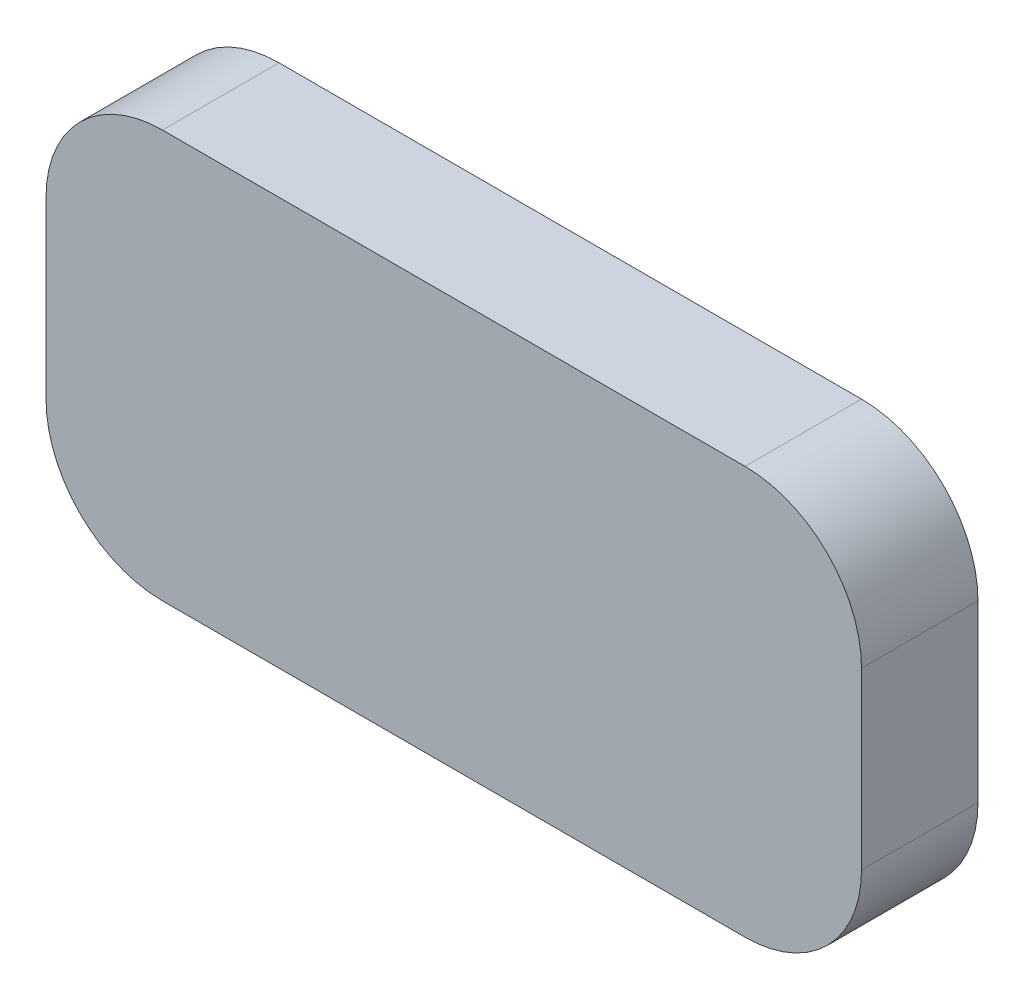
ISO-10303-21;
HEADER;
FILE_DESCRIPTION(('STEP AP214'),'2;1');
FILE_NAME('part.step','',(''),(''),'','','');
FILE_SCHEMA(('AUTOMOTIVE_DESIGN { 1 0 10303 214 1 1 1 1 }'));
ENDSEC;
DATA;
#1=APPLICATION_CONTEXT('core data for automotive mechanical design processes');
#2=APPLICATION_PROTOCOL_DEFINITION('international standard','automotive_design',2000,#1);
#3=PRODUCT_CONTEXT('',#1,'mechanical');
#4=PRODUCT('Part','Part','',(#3));
#5=PRODUCT_RELATED_PRODUCT_CATEGORY('part','',(#4));
#6=PRODUCT_DEFINITION_FORMATION('','',#4);
#7=PRODUCT_DEFINITION_CONTEXT('part definition',#1,'design');
#8=PRODUCT_DEFINITION('design','',#6,#7);
#9=PRODUCT_DEFINITION_SHAPE('','',#8);
#10=(LENGTH_UNIT() NAMED_UNIT(*) SI_UNIT(.MILLI.,.METRE.));
#11=(NAMED_UNIT(*) PLANE_ANGLE_UNIT() SI_UNIT($,.RADIAN.));
#12=(NAMED_UNIT(*) SI_UNIT($,.STERADIAN.) SOLID_ANGLE_UNIT());
#13=UNCERTAINTY_MEASURE_WITH_UNIT(LENGTH_MEASURE(1.E-05),#10,'distance_accuracy_value','');
#14=(GEOMETRIC_REPRESENTATION_CONTEXT(3) GLOBAL_UNCERTAINTY_ASSIGNED_CONTEXT((#13)) GLOBAL_UNIT_ASSIGNED_CONTEXT((#10,
#11,#12)) REPRESENTATION_CONTEXT('',''));
#15=CARTESIAN_POINT('',(0.,0.,0.));
#16=DIRECTION('',(0.,0.,1.));
#17=DIRECTION('',(1.,0.,0.));
#18=AXIS2_PLACEMENT_3D('',#15,#16,#17);
#19=CARTESIAN_POINT('',(7.,3.5,2.));
#20=DIRECTION('',(-1.,0.,0.));
#21=DIRECTION('',(0.,0.,1.));
#22=AXIS2_PLACEMENT_3D('',#19,#20,#21);
#23=PLANE('',#22);
#24=DIRECTION('',(0.,1.,0.));
#25=VECTOR('',#24,1.);
#26=CARTESIAN_POINT('',(7.,3.5,2.));
#27=LINE('',#26,#25);
#28=CARTESIAN_POINT('',(7.,-1.5,2.));
#29=VERTEX_POINT('',#28);
#30=CARTESIAN_POINT('',(7.,1.5,2.));
#31=VERTEX_POINT('',#30);
#32=EDGE_CURVE('E131',#29,#31,#27,.T.);
#33=ORIENTED_EDGE('',*,*,#32,.F.);
#34=DIRECTION('',(0.,0.,-1.));
#35=VECTOR('',#34,1.);
#36=CARTESIAN_POINT('',(7.,-1.5,2.));
#37=LINE('',#36,#35);
#38=CARTESIAN_POINT('',(7.,-1.5,0.));
#39=VERTEX_POINT('',#38);
#40=EDGE_CURVE('E11',#29,#39,#37,.T.);
#41=ORIENTED_EDGE('',*,*,#40,.T.);
#42=DIRECTION('',(0.,1.,0.));
#43=VECTOR('',#42,1.);
#44=CARTESIAN_POINT('',(7.,3.5,0.));
#45=LINE('',#44,#43);
#46=CARTESIAN_POINT('',(7.,1.5,0.));
#47=VERTEX_POINT('',#46);
#48=EDGE_CURVE('E162',#39,#47,#45,.T.);
#49=ORIENTED_EDGE('',*,*,#48,.T.);
#50=DIRECTION('',(0.,0.,-1.));
#51=VECTOR('',#50,1.);
#52=CARTESIAN_POINT('',(7.,1.5,2.));
#53=LINE('',#52,#51);
#54=EDGE_CURVE('E45',#47,#31,#53,.F.);
#55=ORIENTED_EDGE('',*,*,#54,.T.);
#56=EDGE_LOOP('',(#33,#41,#49,#55));
#57=FACE_BOUND('',#56,.T.);
#58=ADVANCED_FACE('F37',(#57),#23,.F.);
#59=CARTESIAN_POINT('',(-7.,3.5,2.));
#60=DIRECTION('',(0.,-1.,0.));
#61=DIRECTION('',(0.,0.,-1.));
#62=AXIS2_PLACEMENT_3D('',#59,#60,#61);
#63=PLANE('',#62);
#64=DIRECTION('',(-1.,0.,0.));
#65=VECTOR('',#64,1.);
#66=CARTESIAN_POINT('',(-7.,3.5,0.));
#67=LINE('',#66,#65);
#68=CARTESIAN_POINT('',(5.,3.5,0.));
#69=VERTEX_POINT('',#68);
#70=CARTESIAN_POINT('',(-5.,3.5,0.));
#71=VERTEX_POINT('',#70);
#72=EDGE_CURVE('E136',#69,#71,#67,.T.);
#73=ORIENTED_EDGE('',*,*,#72,.T.);
#74=DIRECTION('',(0.,0.,-1.));
#75=VECTOR('',#74,1.);
#76=CARTESIAN_POINT('',(-5.,3.5,2.));
#77=LINE('',#76,#75);
#78=CARTESIAN_POINT('',(-5.,3.5,2.));
#79=VERTEX_POINT('',#78);
#80=EDGE_CURVE('E52',#71,#79,#77,.F.);
#81=ORIENTED_EDGE('',*,*,#80,.T.);
#82=DIRECTION('',(-1.,0.,0.));
#83=VECTOR('',#82,1.);
#84=CARTESIAN_POINT('',(-7.,3.5,2.));
#85=LINE('',#84,#83);
#86=CARTESIAN_POINT('',(5.,3.5,2.));
#87=VERTEX_POINT('',#86);
#88=EDGE_CURVE('E134',#87,#79,#85,.T.);
#89=ORIENTED_EDGE('',*,*,#88,.F.);
#90=DIRECTION('',(0.,0.,-1.));
#91=VECTOR('',#90,1.);
#92=CARTESIAN_POINT('',(5.,3.5,2.));
#93=LINE('',#92,#91);
#94=EDGE_CURVE('E154',#87,#69,#93,.T.);
#95=ORIENTED_EDGE('',*,*,#94,.T.);
#96=EDGE_LOOP('',(#73,#81,#89,#95));
#97=FACE_BOUND('',#96,.T.);
#98=ADVANCED_FACE('F169',(#97),#63,.F.);
#99=CARTESIAN_POINT('',(-7.,3.5,2.));
#100=DIRECTION('',(1.,0.,0.));
#101=DIRECTION('',(0.,0.,-1.));
#102=AXIS2_PLACEMENT_3D('',#99,#100,#101);
#103=PLANE('',#102);
#104=DIRECTION('',(0.,-1.,0.));
#105=VECTOR('',#104,1.);
#106=CARTESIAN_POINT('',(-7.,3.5,0.));
#107=LINE('',#106,#105);
#108=CARTESIAN_POINT('',(-7.,1.5,0.));
#109=VERTEX_POINT('',#108);
#110=CARTESIAN_POINT('',(-7.,-1.5,0.));
#111=VERTEX_POINT('',#110);
#112=EDGE_CURVE('E132',#109,#111,#107,.T.);
#113=ORIENTED_EDGE('',*,*,#112,.T.);
#114=DIRECTION('',(0.,0.,-1.));
#115=VECTOR('',#114,1.);
#116=CARTESIAN_POINT('',(-7.,-1.5,2.));
#117=LINE('',#116,#115);
#118=CARTESIAN_POINT('',(-7.,-1.5,2.));
#119=VERTEX_POINT('',#118);
#120=EDGE_CURVE('E109',#111,#119,#117,.F.);
#121=ORIENTED_EDGE('',*,*,#120,.T.);
#122=DIRECTION('',(0.,-1.,0.));
#123=VECTOR('',#122,1.);
#124=CARTESIAN_POINT('',(-7.,3.5,2.));
#125=LINE('',#124,#123);
#126=CARTESIAN_POINT('',(-7.,1.5,2.));
#127=VERTEX_POINT('',#126);
#128=EDGE_CURVE('E173',#127,#119,#125,.T.);
#129=ORIENTED_EDGE('',*,*,#128,.F.);
#130=DIRECTION('',(0.,0.,-1.));
#131=VECTOR('',#130,1.);
#132=CARTESIAN_POINT('',(-7.,1.5,2.));
#133=LINE('',#132,#131);
#134=EDGE_CURVE('E114',#127,#109,#133,.T.);
#135=ORIENTED_EDGE('',*,*,#134,.T.);
#136=EDGE_LOOP('',(#113,#121,#129,#135));
#137=FACE_BOUND('',#136,.T.);
#138=ADVANCED_FACE('F181',(#137),#103,.F.);
#139=CARTESIAN_POINT('',(-7.,-3.5,2.));
#140=DIRECTION('',(0.,1.,0.));
#141=DIRECTION('',(0.,0.,1.));
#142=AXIS2_PLACEMENT_3D('',#139,#140,#141);
#143=PLANE('',#142);
#144=DIRECTION('',(1.,0.,0.));
#145=VECTOR('',#144,1.);
#146=CARTESIAN_POINT('',(-7.,-3.5,2.));
#147=LINE('',#146,#145);
#148=CARTESIAN_POINT('',(-5.,-3.5,2.));
#149=VERTEX_POINT('',#148);
#150=CARTESIAN_POINT('',(5.,-3.5,2.));
#151=VERTEX_POINT('',#150);
#152=EDGE_CURVE('E124',#149,#151,#147,.T.);
#153=ORIENTED_EDGE('',*,*,#152,.F.);
#154=DIRECTION('',(0.,0.,-1.));
#155=VECTOR('',#154,1.);
#156=CARTESIAN_POINT('',(-5.,-3.5,2.));
#157=LINE('',#156,#155);
#158=CARTESIAN_POINT('',(-5.,-3.5,0.));
#159=VERTEX_POINT('',#158);
#160=EDGE_CURVE('E108',#149,#159,#157,.T.);
#161=ORIENTED_EDGE('',*,*,#160,.T.);
#162=DIRECTION('',(1.,0.,0.));
#163=VECTOR('',#162,1.);
#164=CARTESIAN_POINT('',(-7.,-3.5,0.));
#165=LINE('',#164,#163);
#166=CARTESIAN_POINT('',(5.,-3.5,0.));
#167=VERTEX_POINT('',#166);
#168=EDGE_CURVE('E121',#159,#167,#165,.T.);
#169=ORIENTED_EDGE('',*,*,#168,.T.);
#170=DIRECTION('',(0.,0.,-1.));
#171=VECTOR('',#170,1.);
#172=CARTESIAN_POINT('',(5.,-3.5,2.));
#173=LINE('',#172,#171);
#174=EDGE_CURVE('E126',#167,#151,#173,.F.);
#175=ORIENTED_EDGE('',*,*,#174,.T.);
#176=EDGE_LOOP('',(#153,#161,#169,#175));
#177=FACE_BOUND('',#176,.T.);
#178=ADVANCED_FACE('F120',(#177),#143,.F.);
#179=CARTESIAN_POINT('',(0.,0.,2.));
#180=DIRECTION('',(0.,0.,1.));
#181=DIRECTION('',(1.,0.,0.));
#182=AXIS2_PLACEMENT_3D('',#179,#180,#181);
#183=PLANE('',#182);
#184=ORIENTED_EDGE('',*,*,#128,.T.);
#185=CARTESIAN_POINT('',(-5.,-1.5,2.));
#186=DIRECTION('',(0.,0.,1.));
#187=DIRECTION('',(1.,0.,0.));
#188=AXIS2_PLACEMENT_3D('',#185,#186,#187);
#189=CIRCLE('',#188,2.);
#190=EDGE_CURVE('E152',#119,#149,#189,.T.);
#191=ORIENTED_EDGE('',*,*,#190,.T.);
#192=ORIENTED_EDGE('',*,*,#152,.T.);
#193=CARTESIAN_POINT('',(5.,-1.5,2.));
#194=DIRECTION('',(0.,0.,1.));
#195=DIRECTION('',(1.,0.,0.));
#196=AXIS2_PLACEMENT_3D('',#193,#194,#195);
#197=CIRCLE('',#196,2.);
#198=EDGE_CURVE('E148',#151,#29,#197,.T.);
#199=ORIENTED_EDGE('',*,*,#198,.T.);
#200=ORIENTED_EDGE('',*,*,#32,.T.);
#201=CARTESIAN_POINT('',(5.,1.5,2.));
#202=DIRECTION('',(0.,0.,1.));
#203=DIRECTION('',(1.,0.,0.));
#204=AXIS2_PLACEMENT_3D('',#201,#202,#203);
#205=CIRCLE('',#204,2.);
#206=EDGE_CURVE('E59',#31,#87,#205,.T.);
#207=ORIENTED_EDGE('',*,*,#206,.T.);
#208=ORIENTED_EDGE('',*,*,#88,.T.);
#209=CARTESIAN_POINT('',(-5.,1.5,2.));
#210=DIRECTION('',(0.,0.,1.));
#211=DIRECTION('',(1.,0.,0.));
#212=AXIS2_PLACEMENT_3D('',#209,#210,#211);
#213=CIRCLE('',#212,2.);
#214=EDGE_CURVE('E150',#79,#127,#213,.T.);
#215=ORIENTED_EDGE('',*,*,#214,.T.);
#216=EDGE_LOOP('',(#184,#191,#192,#199,#200,#207,#208,#215));
#217=FACE_BOUND('',#216,.T.);
#218=ADVANCED_FACE('F165',(#217),#183,.T.);
#219=CARTESIAN_POINT('',(0.,0.,0.));
#220=DIRECTION('',(0.,0.,1.));
#221=DIRECTION('',(1.,0.,0.));
#222=AXIS2_PLACEMENT_3D('',#219,#220,#221);
#223=PLANE('',#222);
#224=ORIENTED_EDGE('',*,*,#168,.F.);
#225=CARTESIAN_POINT('',(-5.,-1.5,0.));
#226=DIRECTION('',(0.,0.,1.));
#227=DIRECTION('',(1.,0.,0.));
#228=AXIS2_PLACEMENT_3D('',#225,#226,#227);
#229=CIRCLE('',#228,2.);
#230=EDGE_CURVE('E104',#159,#111,#229,.F.);
#231=ORIENTED_EDGE('',*,*,#230,.T.);
#232=ORIENTED_EDGE('',*,*,#112,.F.);
#233=CARTESIAN_POINT('',(-5.,1.5,0.));
#234=DIRECTION('',(0.,0.,1.));
#235=DIRECTION('',(1.,0.,0.));
#236=AXIS2_PLACEMENT_3D('',#233,#234,#235);
#237=CIRCLE('',#236,2.);
#238=EDGE_CURVE('E115',#109,#71,#237,.F.);
#239=ORIENTED_EDGE('',*,*,#238,.T.);
#240=ORIENTED_EDGE('',*,*,#72,.F.);
#241=CARTESIAN_POINT('',(5.,1.5,0.));
#242=DIRECTION('',(0.,0.,1.));
#243=DIRECTION('',(1.,0.,0.));
#244=AXIS2_PLACEMENT_3D('',#241,#242,#243);
#245=CIRCLE('',#244,2.);
#246=EDGE_CURVE('E125',#69,#47,#245,.F.);
#247=ORIENTED_EDGE('',*,*,#246,.T.);
#248=ORIENTED_EDGE('',*,*,#48,.F.);
#249=CARTESIAN_POINT('',(5.,-1.5,0.));
#250=DIRECTION('',(0.,0.,1.));
#251=DIRECTION('',(1.,0.,0.));
#252=AXIS2_PLACEMENT_3D('',#249,#250,#251);
#253=CIRCLE('',#252,2.);
#254=EDGE_CURVE('E130',#39,#167,#253,.F.);
#255=ORIENTED_EDGE('',*,*,#254,.T.);
#256=EDGE_LOOP('',(#224,#231,#232,#239,#240,#247,#248,#255));
#257=FACE_BOUND('',#256,.T.);
#258=ADVANCED_FACE('F128',(#257),#223,.F.);
#259=CARTESIAN_POINT('',(-5.,-1.5,2.));
#260=DIRECTION('',(0.,0.,-1.));
#261=DIRECTION('',(-1.,0.,0.));
#262=AXIS2_PLACEMENT_3D('',#259,#260,#261);
#263=CYLINDRICAL_SURFACE('',#262,2.);
#264=ORIENTED_EDGE('',*,*,#190,.F.);
#265=ORIENTED_EDGE('',*,*,#120,.F.);
#266=ORIENTED_EDGE('',*,*,#230,.F.);
#267=ORIENTED_EDGE('',*,*,#160,.F.);
#268=EDGE_LOOP('',(#264,#265,#266,#267));
#269=FACE_BOUND('',#268,.T.);
#270=ADVANCED_FACE('F107',(#269),#263,.T.);
#271=CARTESIAN_POINT('',(-5.,1.5,2.));
#272=DIRECTION('',(0.,0.,-1.));
#273=DIRECTION('',(-1.,0.,0.));
#274=AXIS2_PLACEMENT_3D('',#271,#272,#273);
#275=CYLINDRICAL_SURFACE('',#274,2.);
#276=ORIENTED_EDGE('',*,*,#214,.F.);
#277=ORIENTED_EDGE('',*,*,#80,.F.);
#278=ORIENTED_EDGE('',*,*,#238,.F.);
#279=ORIENTED_EDGE('',*,*,#134,.F.);
#280=EDGE_LOOP('',(#276,#277,#278,#279));
#281=FACE_BOUND('',#280,.T.);
#282=ADVANCED_FACE('F179',(#281),#275,.T.);
#283=CARTESIAN_POINT('',(5.,-1.5,2.));
#284=DIRECTION('',(0.,0.,-1.));
#285=DIRECTION('',(-1.,0.,0.));
#286=AXIS2_PLACEMENT_3D('',#283,#284,#285);
#287=CYLINDRICAL_SURFACE('',#286,2.);
#288=ORIENTED_EDGE('',*,*,#198,.F.);
#289=ORIENTED_EDGE('',*,*,#174,.F.);
#290=ORIENTED_EDGE('',*,*,#254,.F.);
#291=ORIENTED_EDGE('',*,*,#40,.F.);
#292=EDGE_LOOP('',(#288,#289,#290,#291));
#293=FACE_BOUND('',#292,.T.);
#294=ADVANCED_FACE('F183',(#293),#287,.T.);
#295=CARTESIAN_POINT('',(5.,1.5,2.));
#296=DIRECTION('',(0.,0.,-1.));
#297=DIRECTION('',(-1.,0.,0.));
#298=AXIS2_PLACEMENT_3D('',#295,#296,#297);
#299=CYLINDRICAL_SURFACE('',#298,2.);
#300=ORIENTED_EDGE('',*,*,#206,.F.);
#301=ORIENTED_EDGE('',*,*,#54,.F.);
#302=ORIENTED_EDGE('',*,*,#246,.F.);
#303=ORIENTED_EDGE('',*,*,#94,.F.);
#304=EDGE_LOOP('',(#300,#301,#302,#303));
#305=FACE_BOUND('',#304,.T.);
#306=ADVANCED_FACE('F39',(#305),#299,.T.);
#307=CLOSED_SHELL('',(#58,#98,#138,#178,#218,#258,#270,#282,#294,#306));
#308=MANIFOLD_SOLID_BREP('B2',#307);
#309=ADVANCED_BREP_SHAPE_REPRESENTATION('',(#18,#308),#14);
#310=SHAPE_DEFINITION_REPRESENTATION(#9,#309);
ENDSEC;
END-ISO-10303-21;
